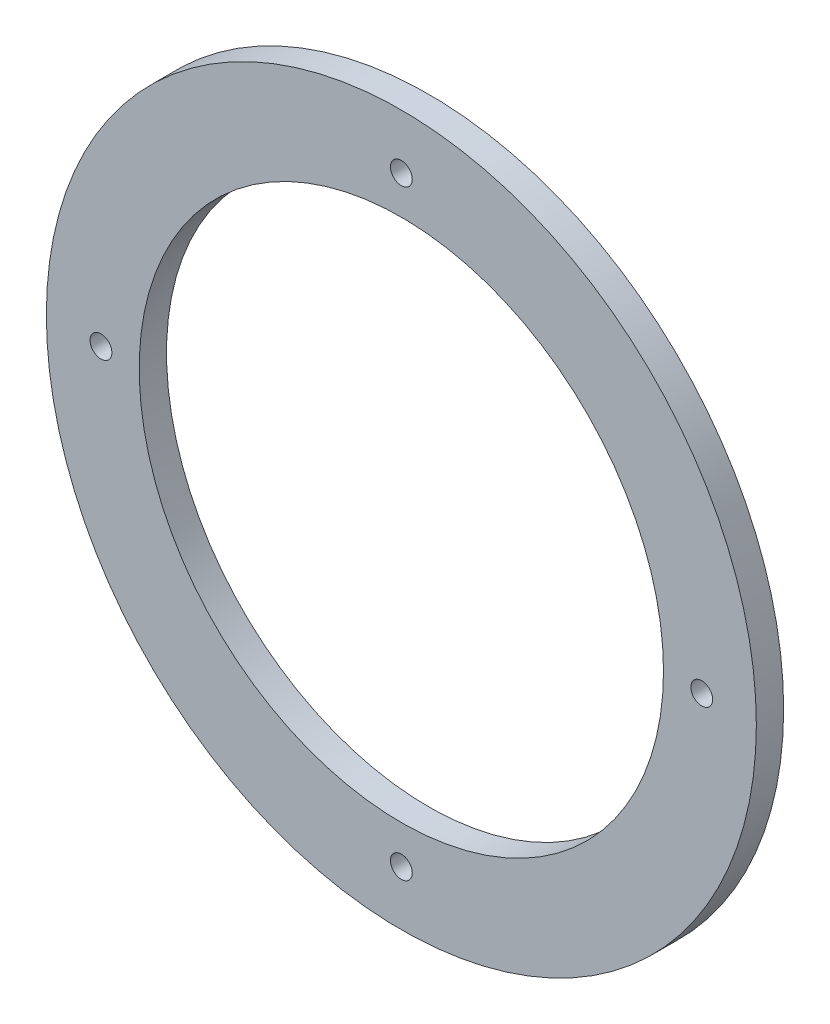
ISO-10303-21;
HEADER;
FILE_DESCRIPTION(('STEP AP214'),'2;1');
FILE_NAME('part.step','',(''),(''),'','','');
FILE_SCHEMA(('AUTOMOTIVE_DESIGN { 1 0 10303 214 1 1 1 1 }'));
ENDSEC;
DATA;
#1=APPLICATION_CONTEXT('core data for automotive mechanical design processes');
#2=APPLICATION_PROTOCOL_DEFINITION('international standard','automotive_design',2000,#1);
#3=PRODUCT_CONTEXT('',#1,'mechanical');
#4=PRODUCT('Part','Part','',(#3));
#5=PRODUCT_RELATED_PRODUCT_CATEGORY('part','',(#4));
#6=PRODUCT_DEFINITION_FORMATION('','',#4);
#7=PRODUCT_DEFINITION_CONTEXT('part definition',#1,'design');
#8=PRODUCT_DEFINITION('design','',#6,#7);
#9=PRODUCT_DEFINITION_SHAPE('','',#8);
#10=(LENGTH_UNIT() NAMED_UNIT(*) SI_UNIT(.MILLI.,.METRE.));
#11=(NAMED_UNIT(*) PLANE_ANGLE_UNIT() SI_UNIT($,.RADIAN.));
#12=(NAMED_UNIT(*) SI_UNIT($,.STERADIAN.) SOLID_ANGLE_UNIT());
#13=UNCERTAINTY_MEASURE_WITH_UNIT(LENGTH_MEASURE(1.E-05),#10,'distance_accuracy_value','');
#14=(GEOMETRIC_REPRESENTATION_CONTEXT(3) GLOBAL_UNCERTAINTY_ASSIGNED_CONTEXT((#13)) GLOBAL_UNIT_ASSIGNED_CONTEXT((#10,
#11,#12)) REPRESENTATION_CONTEXT('',''));
#15=CARTESIAN_POINT('',(0.,0.,0.));
#16=DIRECTION('',(0.,0.,1.));
#17=DIRECTION('',(1.,0.,0.));
#18=AXIS2_PLACEMENT_3D('',#15,#16,#17);
#19=CARTESIAN_POINT('',(0.,0.,5.));
#20=DIRECTION('',(0.,0.,1.));
#21=DIRECTION('',(1.,0.,0.));
#22=AXIS2_PLACEMENT_3D('',#19,#20,#21);
#23=PLANE('',#22);
#24=CARTESIAN_POINT('',(-55.,3.84062947272745E-13,5.));
#25=DIRECTION('',(0.,0.,1.));
#26=DIRECTION('',(1.,0.,0.));
#27=AXIS2_PLACEMENT_3D('',#24,#25,#26);
#28=CIRCLE('',#27,2.00000000000001);
#29=CARTESIAN_POINT('',(-53.,3.84062947272745E-13,5.));
#30=VERTEX_POINT('',#29);
#31=EDGE_CURVE('E61',#30,#30,#28,.T.);
#32=ORIENTED_EDGE('',*,*,#31,.F.);
#33=EDGE_LOOP('',(#32));
#34=FACE_BOUND('',#33,.T.);
#35=CARTESIAN_POINT('',(55.,0.,5.));
#36=DIRECTION('',(0.,0.,1.));
#37=DIRECTION('',(1.,0.,0.));
#38=AXIS2_PLACEMENT_3D('',#35,#36,#37);
#39=CIRCLE('',#38,2.);
#40=CARTESIAN_POINT('',(57.,0.,5.));
#41=VERTEX_POINT('',#40);
#42=EDGE_CURVE('E49',#41,#41,#39,.T.);
#43=ORIENTED_EDGE('',*,*,#42,.F.);
#44=EDGE_LOOP('',(#43));
#45=FACE_BOUND('',#44,.T.);
#46=CARTESIAN_POINT('',(0.,0.,5.));
#47=DIRECTION('',(0.,0.,1.));
#48=DIRECTION('',(1.,0.,0.));
#49=AXIS2_PLACEMENT_3D('',#46,#47,#48);
#50=CIRCLE('',#49,65.);
#51=CARTESIAN_POINT('',(65.,0.,5.));
#52=VERTEX_POINT('',#51);
#53=EDGE_CURVE('E10',#52,#52,#50,.T.);
#54=ORIENTED_EDGE('',*,*,#53,.T.);
#55=EDGE_LOOP('',(#54));
#56=FACE_BOUND('',#55,.T.);
#57=CARTESIAN_POINT('',(0.,0.,5.));
#58=DIRECTION('',(0.,0.,1.));
#59=DIRECTION('',(1.,0.,0.));
#60=AXIS2_PLACEMENT_3D('',#57,#58,#59);
#61=CIRCLE('',#60,48.);
#62=CARTESIAN_POINT('',(48.,0.,5.));
#63=VERTEX_POINT('',#62);
#64=EDGE_CURVE('E44',#63,#63,#61,.T.);
#65=ORIENTED_EDGE('',*,*,#64,.F.);
#66=EDGE_LOOP('',(#65));
#67=FACE_BOUND('',#66,.T.);
#68=CARTESIAN_POINT('',(-1.92031473636372E-13,-55.,5.));
#69=DIRECTION('',(0.,0.,1.));
#70=DIRECTION('',(1.,0.,0.));
#71=AXIS2_PLACEMENT_3D('',#68,#69,#70);
#72=CIRCLE('',#71,2.);
#73=CARTESIAN_POINT('',(1.99999999999981,-55.,5.));
#74=VERTEX_POINT('',#73);
#75=EDGE_CURVE('E55',#74,#74,#72,.T.);
#76=ORIENTED_EDGE('',*,*,#75,.F.);
#77=EDGE_LOOP('',(#76));
#78=FACE_BOUND('',#77,.T.);
#79=CARTESIAN_POINT('',(5.76094420909117E-13,55.,5.));
#80=DIRECTION('',(0.,0.,1.));
#81=DIRECTION('',(1.,0.,0.));
#82=AXIS2_PLACEMENT_3D('',#79,#80,#81);
#83=CIRCLE('',#82,2.);
#84=CARTESIAN_POINT('',(2.00000000000058,55.,5.));
#85=VERTEX_POINT('',#84);
#86=EDGE_CURVE('E67',#85,#85,#83,.T.);
#87=ORIENTED_EDGE('',*,*,#86,.F.);
#88=EDGE_LOOP('',(#87));
#89=FACE_BOUND('',#88,.T.);
#90=ADVANCED_FACE('F33',(#34,#45,#56,#67,#78,#89),#23,.T.);
#91=CARTESIAN_POINT('',(0.,0.,0.));
#92=DIRECTION('',(0.,0.,1.));
#93=DIRECTION('',(1.,0.,0.));
#94=AXIS2_PLACEMENT_3D('',#91,#92,#93);
#95=PLANE('',#94);
#96=CARTESIAN_POINT('',(0.,0.,0.));
#97=DIRECTION('',(0.,0.,1.));
#98=DIRECTION('',(1.,0.,0.));
#99=AXIS2_PLACEMENT_3D('',#96,#97,#98);
#100=CIRCLE('',#99,65.);
#101=CARTESIAN_POINT('',(65.,0.,0.));
#102=VERTEX_POINT('',#101);
#103=EDGE_CURVE('E37',#102,#102,#100,.T.);
#104=ORIENTED_EDGE('',*,*,#103,.F.);
#105=EDGE_LOOP('',(#104));
#106=FACE_BOUND('',#105,.T.);
#107=CARTESIAN_POINT('',(0.,0.,0.));
#108=DIRECTION('',(0.,0.,1.));
#109=DIRECTION('',(1.,0.,0.));
#110=AXIS2_PLACEMENT_3D('',#107,#108,#109);
#111=CIRCLE('',#110,48.);
#112=CARTESIAN_POINT('',(48.,0.,0.));
#113=VERTEX_POINT('',#112);
#114=EDGE_CURVE('E46',#113,#113,#111,.T.);
#115=ORIENTED_EDGE('',*,*,#114,.T.);
#116=EDGE_LOOP('',(#115));
#117=FACE_BOUND('',#116,.T.);
#118=CARTESIAN_POINT('',(55.,0.,0.));
#119=DIRECTION('',(0.,0.,1.));
#120=DIRECTION('',(1.,0.,0.));
#121=AXIS2_PLACEMENT_3D('',#118,#119,#120);
#122=CIRCLE('',#121,2.);
#123=CARTESIAN_POINT('',(57.,0.,0.));
#124=VERTEX_POINT('',#123);
#125=EDGE_CURVE('E52',#124,#124,#122,.T.);
#126=ORIENTED_EDGE('',*,*,#125,.T.);
#127=EDGE_LOOP('',(#126));
#128=FACE_BOUND('',#127,.T.);
#129=CARTESIAN_POINT('',(-1.92031473636372E-13,-55.,0.));
#130=DIRECTION('',(0.,0.,1.));
#131=DIRECTION('',(1.,0.,0.));
#132=AXIS2_PLACEMENT_3D('',#129,#130,#131);
#133=CIRCLE('',#132,2.);
#134=CARTESIAN_POINT('',(1.99999999999981,-55.,0.));
#135=VERTEX_POINT('',#134);
#136=EDGE_CURVE('E58',#135,#135,#133,.T.);
#137=ORIENTED_EDGE('',*,*,#136,.T.);
#138=EDGE_LOOP('',(#137));
#139=FACE_BOUND('',#138,.T.);
#140=CARTESIAN_POINT('',(-55.,3.84062947272745E-13,0.));
#141=DIRECTION('',(0.,0.,1.));
#142=DIRECTION('',(1.,0.,0.));
#143=AXIS2_PLACEMENT_3D('',#140,#141,#142);
#144=CIRCLE('',#143,2.00000000000001);
#145=CARTESIAN_POINT('',(-53.,3.84062947272745E-13,0.));
#146=VERTEX_POINT('',#145);
#147=EDGE_CURVE('E64',#146,#146,#144,.T.);
#148=ORIENTED_EDGE('',*,*,#147,.T.);
#149=EDGE_LOOP('',(#148));
#150=FACE_BOUND('',#149,.T.);
#151=CARTESIAN_POINT('',(5.76094420909117E-13,55.,0.));
#152=DIRECTION('',(0.,0.,1.));
#153=DIRECTION('',(1.,0.,0.));
#154=AXIS2_PLACEMENT_3D('',#151,#152,#153);
#155=CIRCLE('',#154,2.);
#156=CARTESIAN_POINT('',(2.00000000000058,55.,0.));
#157=VERTEX_POINT('',#156);
#158=EDGE_CURVE('E70',#157,#157,#155,.T.);
#159=ORIENTED_EDGE('',*,*,#158,.T.);
#160=EDGE_LOOP('',(#159));
#161=FACE_BOUND('',#160,.T.);
#162=ADVANCED_FACE('F80',(#106,#117,#128,#139,#150,#161),#95,.F.);
#163=CARTESIAN_POINT('',(0.,0.,5.));
#164=DIRECTION('',(0.,0.,-1.));
#165=DIRECTION('',(-1.,0.,0.));
#166=AXIS2_PLACEMENT_3D('',#163,#164,#165);
#167=CYLINDRICAL_SURFACE('',#166,65.);
#168=ORIENTED_EDGE('',*,*,#53,.F.);
#169=EDGE_LOOP('',(#168));
#170=FACE_BOUND('',#169,.T.);
#171=ORIENTED_EDGE('',*,*,#103,.T.);
#172=EDGE_LOOP('',(#171));
#173=FACE_BOUND('',#172,.T.);
#174=ADVANCED_FACE('F35',(#170,#173),#167,.T.);
#175=CARTESIAN_POINT('',(0.,0.,5.));
#176=DIRECTION('',(0.,0.,-1.));
#177=DIRECTION('',(-1.,0.,0.));
#178=AXIS2_PLACEMENT_3D('',#175,#176,#177);
#179=CYLINDRICAL_SURFACE('',#178,48.);
#180=ORIENTED_EDGE('',*,*,#64,.T.);
#181=EDGE_LOOP('',(#180));
#182=FACE_BOUND('',#181,.T.);
#183=ORIENTED_EDGE('',*,*,#114,.F.);
#184=EDGE_LOOP('',(#183));
#185=FACE_BOUND('',#184,.T.);
#186=ADVANCED_FACE('F90',(#182,#185),#179,.F.);
#187=CARTESIAN_POINT('',(55.,0.,5.));
#188=DIRECTION('',(0.,0.,-1.));
#189=DIRECTION('',(-1.,0.,0.));
#190=AXIS2_PLACEMENT_3D('',#187,#188,#189);
#191=CYLINDRICAL_SURFACE('',#190,2.);
#192=ORIENTED_EDGE('',*,*,#42,.T.);
#193=EDGE_LOOP('',(#192));
#194=FACE_BOUND('',#193,.T.);
#195=ORIENTED_EDGE('',*,*,#125,.F.);
#196=EDGE_LOOP('',(#195));
#197=FACE_BOUND('',#196,.T.);
#198=ADVANCED_FACE('F93',(#194,#197),#191,.F.);
#199=CARTESIAN_POINT('',(-1.92031473636372E-13,-55.,5.));
#200=DIRECTION('',(0.,0.,-1.));
#201=DIRECTION('',(-1.,0.,0.));
#202=AXIS2_PLACEMENT_3D('',#199,#200,#201);
#203=CYLINDRICAL_SURFACE('',#202,2.);
#204=ORIENTED_EDGE('',*,*,#75,.T.);
#205=EDGE_LOOP('',(#204));
#206=FACE_BOUND('',#205,.T.);
#207=ORIENTED_EDGE('',*,*,#136,.F.);
#208=EDGE_LOOP('',(#207));
#209=FACE_BOUND('',#208,.T.);
#210=ADVANCED_FACE('F97',(#206,#209),#203,.F.);
#211=CARTESIAN_POINT('',(-55.,3.84062947272745E-13,5.));
#212=DIRECTION('',(0.,0.,-1.));
#213=DIRECTION('',(-1.,0.,0.));
#214=AXIS2_PLACEMENT_3D('',#211,#212,#213);
#215=CYLINDRICAL_SURFACE('',#214,2.00000000000001);
#216=ORIENTED_EDGE('',*,*,#31,.T.);
#217=EDGE_LOOP('',(#216));
#218=FACE_BOUND('',#217,.T.);
#219=ORIENTED_EDGE('',*,*,#147,.F.);
#220=EDGE_LOOP('',(#219));
#221=FACE_BOUND('',#220,.T.);
#222=ADVANCED_FACE('F101',(#218,#221),#215,.F.);
#223=CARTESIAN_POINT('',(5.76094420909117E-13,55.,5.));
#224=DIRECTION('',(0.,0.,-1.));
#225=DIRECTION('',(-1.,0.,0.));
#226=AXIS2_PLACEMENT_3D('',#223,#224,#225);
#227=CYLINDRICAL_SURFACE('',#226,2.);
#228=ORIENTED_EDGE('',*,*,#86,.T.);
#229=EDGE_LOOP('',(#228));
#230=FACE_BOUND('',#229,.T.);
#231=ORIENTED_EDGE('',*,*,#158,.F.);
#232=EDGE_LOOP('',(#231));
#233=FACE_BOUND('',#232,.T.);
#234=ADVANCED_FACE('F76',(#230,#233),#227,.F.);
#235=CLOSED_SHELL('',(#90,#162,#174,#186,#198,#210,#222,#234));
#236=MANIFOLD_SOLID_BREP('B2',#235);
#237=ADVANCED_BREP_SHAPE_REPRESENTATION('',(#18,#236),#14);
#238=SHAPE_DEFINITION_REPRESENTATION(#9,#237);
ENDSEC;
END-ISO-10303-21;
